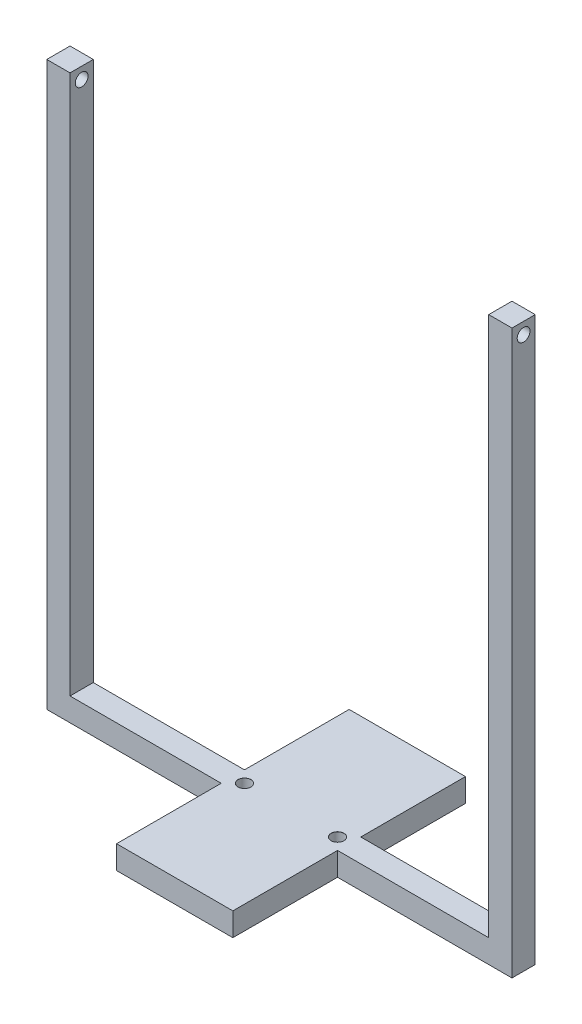
ISO-10303-21;
HEADER;
FILE_DESCRIPTION(('STEP AP214'),'2;1');
FILE_NAME('part.step','',(''),(''),'','','');
FILE_SCHEMA(('AUTOMOTIVE_DESIGN { 1 0 10303 214 1 1 1 1 }'));
ENDSEC;
DATA;
#1=APPLICATION_CONTEXT('core data for automotive mechanical design processes');
#2=APPLICATION_PROTOCOL_DEFINITION('international standard','automotive_design',2000,#1);
#3=PRODUCT_CONTEXT('',#1,'mechanical');
#4=PRODUCT('Part','Part','',(#3));
#5=PRODUCT_RELATED_PRODUCT_CATEGORY('part','',(#4));
#6=PRODUCT_DEFINITION_FORMATION('','',#4);
#7=PRODUCT_DEFINITION_CONTEXT('part definition',#1,'design');
#8=PRODUCT_DEFINITION('design','',#6,#7);
#9=PRODUCT_DEFINITION_SHAPE('','',#8);
#10=(LENGTH_UNIT() NAMED_UNIT(*) SI_UNIT(.MILLI.,.METRE.));
#11=(NAMED_UNIT(*) PLANE_ANGLE_UNIT() SI_UNIT($,.RADIAN.));
#12=(NAMED_UNIT(*) SI_UNIT($,.STERADIAN.) SOLID_ANGLE_UNIT());
#13=UNCERTAINTY_MEASURE_WITH_UNIT(LENGTH_MEASURE(1.E-05),#10,'distance_accuracy_value','');
#14=(GEOMETRIC_REPRESENTATION_CONTEXT(3) GLOBAL_UNCERTAINTY_ASSIGNED_CONTEXT((#13)) GLOBAL_UNIT_ASSIGNED_CONTEXT((#10,
#11,#12)) REPRESENTATION_CONTEXT('',''));
#15=CARTESIAN_POINT('',(0.,0.,0.));
#16=DIRECTION('',(0.,0.,1.));
#17=DIRECTION('',(1.,0.,0.));
#18=AXIS2_PLACEMENT_3D('',#15,#16,#17);
#19=CARTESIAN_POINT('',(0.,25.,0.));
#20=DIRECTION('',(0.,1.,0.));
#21=DIRECTION('',(0.,0.,1.));
#22=AXIS2_PLACEMENT_3D('',#19,#20,#21);
#23=PLANE('',#22);
#24=CARTESIAN_POINT('',(-20.,25.,0.));
#25=DIRECTION('',(0.,1.,0.));
#26=DIRECTION('',(0.,0.,1.));
#27=AXIS2_PLACEMENT_3D('',#24,#25,#26);
#28=CIRCLE('',#27,2.775);
#29=CARTESIAN_POINT('',(-20.,25.,2.775));
#30=VERTEX_POINT('',#29);
#31=EDGE_CURVE('E617',#30,#30,#28,.T.);
#32=ORIENTED_EDGE('',*,*,#31,.F.);
#33=EDGE_LOOP('',(#32));
#34=FACE_BOUND('',#33,.T.);
#35=CARTESIAN_POINT('',(20.,25.,0.));
#36=DIRECTION('',(0.,1.,0.));
#37=DIRECTION('',(0.,0.,1.));
#38=AXIS2_PLACEMENT_3D('',#35,#36,#37);
#39=CIRCLE('',#38,2.775);
#40=CARTESIAN_POINT('',(20.,25.,2.77499999999999));
#41=VERTEX_POINT('',#40);
#42=EDGE_CURVE('E298',#41,#41,#39,.T.);
#43=ORIENTED_EDGE('',*,*,#42,.F.);
#44=EDGE_LOOP('',(#43));
#45=FACE_BOUND('',#44,.T.);
#46=DIRECTION('',(1.,0.,0.));
#47=VECTOR('',#46,1.);
#48=CARTESIAN_POINT('',(0.,25.,5.));
#49=LINE('',#48,#47);
#50=CARTESIAN_POINT('',(25.,25.,5.));
#51=VERTEX_POINT('',#50);
#52=CARTESIAN_POINT('',(90.,25.,5.));
#53=VERTEX_POINT('',#52);
#54=EDGE_CURVE('E63',#51,#53,#49,.T.);
#55=ORIENTED_EDGE('',*,*,#54,.T.);
#56=DIRECTION('',(0.,0.,1.));
#57=VECTOR('',#56,1.);
#58=CARTESIAN_POINT('',(90.,25.,-5.));
#59=LINE('',#58,#57);
#60=CARTESIAN_POINT('',(90.,25.,-5.));
#61=VERTEX_POINT('',#60);
#62=EDGE_CURVE('E58',#61,#53,#59,.T.);
#63=ORIENTED_EDGE('',*,*,#62,.F.);
#64=DIRECTION('',(1.,0.,0.));
#65=VECTOR('',#64,1.);
#66=CARTESIAN_POINT('',(0.,25.,-5.));
#67=LINE('',#66,#65);
#68=CARTESIAN_POINT('',(25.,25.,-5.));
#69=VERTEX_POINT('',#68);
#70=EDGE_CURVE('E217',#69,#61,#67,.T.);
#71=ORIENTED_EDGE('',*,*,#70,.F.);
#72=DIRECTION('',(0.,0.,1.));
#73=VECTOR('',#72,1.);
#74=CARTESIAN_POINT('',(24.9999999999999,25.,0.));
#75=LINE('',#74,#73);
#76=CARTESIAN_POINT('',(25.,25.,-50.));
#77=VERTEX_POINT('',#76);
#78=EDGE_CURVE('E219',#77,#69,#75,.T.);
#79=ORIENTED_EDGE('',*,*,#78,.F.);
#80=DIRECTION('',(1.,0.,0.));
#81=VECTOR('',#80,1.);
#82=CARTESIAN_POINT('',(0.,25.,-50.));
#83=LINE('',#82,#81);
#84=CARTESIAN_POINT('',(-25.,25.,-50.));
#85=VERTEX_POINT('',#84);
#86=EDGE_CURVE('E222',#85,#77,#83,.T.);
#87=ORIENTED_EDGE('',*,*,#86,.F.);
#88=DIRECTION('',(0.,0.,-1.));
#89=VECTOR('',#88,1.);
#90=CARTESIAN_POINT('',(-24.9999999999999,25.,0.));
#91=LINE('',#90,#89);
#92=CARTESIAN_POINT('',(-24.9999999999999,25.,-5.));
#93=VERTEX_POINT('',#92);
#94=EDGE_CURVE('E225',#93,#85,#91,.T.);
#95=ORIENTED_EDGE('',*,*,#94,.F.);
#96=DIRECTION('',(1.,0.,0.));
#97=VECTOR('',#96,1.);
#98=CARTESIAN_POINT('',(0.,25.,-5.));
#99=LINE('',#98,#97);
#100=CARTESIAN_POINT('',(-90.,25.,-5.));
#101=VERTEX_POINT('',#100);
#102=EDGE_CURVE('E228',#101,#93,#99,.T.);
#103=ORIENTED_EDGE('',*,*,#102,.F.);
#104=DIRECTION('',(0.,0.,-1.));
#105=VECTOR('',#104,1.);
#106=CARTESIAN_POINT('',(-90.,25.,-5.));
#107=LINE('',#106,#105);
#108=CARTESIAN_POINT('',(-90.,25.,5.));
#109=VERTEX_POINT('',#108);
#110=EDGE_CURVE('E183',#109,#101,#107,.T.);
#111=ORIENTED_EDGE('',*,*,#110,.F.);
#112=DIRECTION('',(1.,0.,0.));
#113=VECTOR('',#112,1.);
#114=CARTESIAN_POINT('',(0.,25.,5.));
#115=LINE('',#114,#113);
#116=CARTESIAN_POINT('',(-25.,25.,5.));
#117=VERTEX_POINT('',#116);
#118=EDGE_CURVE('E207',#109,#117,#115,.T.);
#119=ORIENTED_EDGE('',*,*,#118,.T.);
#120=DIRECTION('',(0.,0.,1.));
#121=VECTOR('',#120,1.);
#122=CARTESIAN_POINT('',(-24.9999999999999,25.,0.));
#123=LINE('',#122,#121);
#124=CARTESIAN_POINT('',(-25.,25.,50.));
#125=VERTEX_POINT('',#124);
#126=EDGE_CURVE('E209',#117,#125,#123,.T.);
#127=ORIENTED_EDGE('',*,*,#126,.T.);
#128=DIRECTION('',(1.,0.,0.));
#129=VECTOR('',#128,1.);
#130=CARTESIAN_POINT('',(0.,25.,50.));
#131=LINE('',#130,#129);
#132=CARTESIAN_POINT('',(25.,25.,50.));
#133=VERTEX_POINT('',#132);
#134=EDGE_CURVE('E212',#125,#133,#131,.T.);
#135=ORIENTED_EDGE('',*,*,#134,.T.);
#136=DIRECTION('',(0.,0.,-1.));
#137=VECTOR('',#136,1.);
#138=CARTESIAN_POINT('',(24.9999999999999,25.,0.));
#139=LINE('',#138,#137);
#140=EDGE_CURVE('E214',#133,#51,#139,.T.);
#141=ORIENTED_EDGE('',*,*,#140,.T.);
#142=EDGE_LOOP('',(#55,#63,#71,#79,#87,#95,#103,#111,#119,#127,#135,#141));
#143=FACE_BOUND('',#142,.T.);
#144=ADVANCED_FACE('F41',(#34,#45,#143),#23,.T.);
#145=CARTESIAN_POINT('',(0.,10.,0.));
#146=DIRECTION('',(0.,-1.,0.));
#147=DIRECTION('',(0.,0.,-1.));
#148=AXIS2_PLACEMENT_3D('',#145,#146,#147);
#149=CYLINDRICAL_SURFACE('',#148,10.);
#150=CARTESIAN_POINT('',(0.,10.,0.));
#151=DIRECTION('',(0.,1.,0.));
#152=DIRECTION('',(0.,0.,1.));
#153=AXIS2_PLACEMENT_3D('',#150,#151,#152);
#154=CIRCLE('',#153,10.);
#155=CARTESIAN_POINT('',(0.,10.,10.));
#156=VERTEX_POINT('',#155);
#157=EDGE_CURVE('E11',#156,#156,#154,.T.);
#158=ORIENTED_EDGE('',*,*,#157,.F.);
#159=EDGE_LOOP('',(#158));
#160=FACE_BOUND('',#159,.T.);
#161=CARTESIAN_POINT('',(0.,0.,0.));
#162=DIRECTION('',(0.,1.,0.));
#163=DIRECTION('',(0.,0.,1.));
#164=AXIS2_PLACEMENT_3D('',#161,#162,#163);
#165=CIRCLE('',#164,10.);
#166=CARTESIAN_POINT('',(0.,0.,10.));
#167=VERTEX_POINT('',#166);
#168=EDGE_CURVE('E50',#167,#167,#165,.T.);
#169=ORIENTED_EDGE('',*,*,#168,.T.);
#170=EDGE_LOOP('',(#169));
#171=FACE_BOUND('',#170,.T.);
#172=ADVANCED_FACE('F43',(#160,#171),#149,.T.);
#173=CARTESIAN_POINT('',(0.,0.,0.));
#174=DIRECTION('',(0.,1.,0.));
#175=DIRECTION('',(0.,0.,1.));
#176=AXIS2_PLACEMENT_3D('',#173,#174,#175);
#177=PLANE('',#176);
#178=ORIENTED_EDGE('',*,*,#168,.F.);
#179=EDGE_LOOP('',(#178));
#180=FACE_BOUND('',#179,.T.);
#181=ADVANCED_FACE('F397',(#180),#177,.F.);
#182=CARTESIAN_POINT('',(0.,15.,0.));
#183=DIRECTION('',(0.,-1.,0.));
#184=DIRECTION('',(0.,0.,-1.));
#185=AXIS2_PLACEMENT_3D('',#182,#183,#184);
#186=CYLINDRICAL_SURFACE('',#185,15.);
#187=CARTESIAN_POINT('',(0.,15.,0.));
#188=DIRECTION('',(0.,1.,0.));
#189=DIRECTION('',(0.,0.,1.));
#190=AXIS2_PLACEMENT_3D('',#187,#188,#189);
#191=CIRCLE('',#190,15.);
#192=CARTESIAN_POINT('',(0.,15.,15.));
#193=VERTEX_POINT('',#192);
#194=EDGE_CURVE('E282',#193,#193,#191,.T.);
#195=ORIENTED_EDGE('',*,*,#194,.F.);
#196=EDGE_LOOP('',(#195));
#197=FACE_BOUND('',#196,.T.);
#198=CARTESIAN_POINT('',(0.,10.,0.));
#199=DIRECTION('',(0.,1.,0.));
#200=DIRECTION('',(0.,0.,1.));
#201=AXIS2_PLACEMENT_3D('',#198,#199,#200);
#202=CIRCLE('',#201,15.);
#203=CARTESIAN_POINT('',(0.,10.,15.));
#204=VERTEX_POINT('',#203);
#205=EDGE_CURVE('E281',#204,#204,#202,.T.);
#206=ORIENTED_EDGE('',*,*,#205,.T.);
#207=EDGE_LOOP('',(#206));
#208=FACE_BOUND('',#207,.T.);
#209=ADVANCED_FACE('F432',(#197,#208),#186,.T.);
#210=CARTESIAN_POINT('',(0.,10.,0.));
#211=DIRECTION('',(0.,1.,0.));
#212=DIRECTION('',(0.,0.,1.));
#213=AXIS2_PLACEMENT_3D('',#210,#211,#212);
#214=PLANE('',#213);
#215=ORIENTED_EDGE('',*,*,#157,.T.);
#216=EDGE_LOOP('',(#215));
#217=FACE_BOUND('',#216,.T.);
#218=ORIENTED_EDGE('',*,*,#205,.F.);
#219=EDGE_LOOP('',(#218));
#220=FACE_BOUND('',#219,.T.);
#221=ADVANCED_FACE('F429',(#217,#220),#214,.F.);
#222=CARTESIAN_POINT('',(0.,25.,5.));
#223=DIRECTION('',(0.,0.,-1.));
#224=DIRECTION('',(-1.,0.,0.));
#225=AXIS2_PLACEMENT_3D('',#222,#223,#224);
#226=PLANE('',#225);
#227=DIRECTION('',(1.,0.,0.));
#228=VECTOR('',#227,1.);
#229=CARTESIAN_POINT('',(0.,15.,5.));
#230=LINE('',#229,#228);
#231=CARTESIAN_POINT('',(-100.,15.,5.));
#232=VERTEX_POINT('',#231);
#233=CARTESIAN_POINT('',(-25.,15.,5.));
#234=VERTEX_POINT('',#233);
#235=EDGE_CURVE('E206',#232,#234,#230,.T.);
#236=ORIENTED_EDGE('',*,*,#235,.T.);
#237=DIRECTION('',(0.,-1.,0.));
#238=VECTOR('',#237,1.);
#239=CARTESIAN_POINT('',(-25.,25.,5.));
#240=LINE('',#239,#238);
#241=EDGE_CURVE('E278',#117,#234,#240,.T.);
#242=ORIENTED_EDGE('',*,*,#241,.F.);
#243=ORIENTED_EDGE('',*,*,#118,.F.);
#244=DIRECTION('',(0.,-1.,0.));
#245=VECTOR('',#244,1.);
#246=CARTESIAN_POINT('',(-90.,257.,5.));
#247=LINE('',#246,#245);
#248=CARTESIAN_POINT('',(-90.,257.,5.));
#249=VERTEX_POINT('',#248);
#250=EDGE_CURVE('E203',#249,#109,#247,.T.);
#251=ORIENTED_EDGE('',*,*,#250,.F.);
#252=DIRECTION('',(1.,0.,0.));
#253=VECTOR('',#252,1.);
#254=CARTESIAN_POINT('',(-100.,257.,5.));
#255=LINE('',#254,#253);
#256=CARTESIAN_POINT('',(-100.,257.,5.));
#257=VERTEX_POINT('',#256);
#258=EDGE_CURVE('E191',#257,#249,#255,.T.);
#259=ORIENTED_EDGE('',*,*,#258,.F.);
#260=DIRECTION('',(0.,-1.,0.));
#261=VECTOR('',#260,1.);
#262=CARTESIAN_POINT('',(-100.,25.,5.));
#263=LINE('',#262,#261);
#264=EDGE_CURVE('E230',#257,#232,#263,.T.);
#265=ORIENTED_EDGE('',*,*,#264,.T.);
#266=EDGE_LOOP('',(#236,#242,#243,#251,#259,#265));
#267=FACE_BOUND('',#266,.T.);
#268=ADVANCED_FACE('F351',(#267),#226,.F.);
#269=CARTESIAN_POINT('',(-24.9999999999999,25.,0.));
#270=DIRECTION('',(1.,0.,0.));
#271=DIRECTION('',(0.,0.,-1.));
#272=AXIS2_PLACEMENT_3D('',#269,#270,#271);
#273=PLANE('',#272);
#274=DIRECTION('',(0.,0.,1.));
#275=VECTOR('',#274,1.);
#276=CARTESIAN_POINT('',(-24.9999999999999,15.,0.));
#277=LINE('',#276,#275);
#278=CARTESIAN_POINT('',(-25.,15.,50.));
#279=VERTEX_POINT('',#278);
#280=EDGE_CURVE('E233',#234,#279,#277,.T.);
#281=ORIENTED_EDGE('',*,*,#280,.T.);
#282=DIRECTION('',(0.,-1.,0.));
#283=VECTOR('',#282,1.);
#284=CARTESIAN_POINT('',(-25.,25.,50.));
#285=LINE('',#284,#283);
#286=EDGE_CURVE('E275',#125,#279,#285,.T.);
#287=ORIENTED_EDGE('',*,*,#286,.F.);
#288=ORIENTED_EDGE('',*,*,#126,.F.);
#289=ORIENTED_EDGE('',*,*,#241,.T.);
#290=EDGE_LOOP('',(#281,#287,#288,#289));
#291=FACE_BOUND('',#290,.T.);
#292=ADVANCED_FACE('F356',(#291),#273,.F.);
#293=CARTESIAN_POINT('',(0.,25.,50.));
#294=DIRECTION('',(0.,0.,-1.));
#295=DIRECTION('',(-1.,0.,0.));
#296=AXIS2_PLACEMENT_3D('',#293,#294,#295);
#297=PLANE('',#296);
#298=DIRECTION('',(1.,0.,0.));
#299=VECTOR('',#298,1.);
#300=CARTESIAN_POINT('',(0.,15.,50.));
#301=LINE('',#300,#299);
#302=CARTESIAN_POINT('',(25.,15.,50.));
#303=VERTEX_POINT('',#302);
#304=EDGE_CURVE('E235',#279,#303,#301,.T.);
#305=ORIENTED_EDGE('',*,*,#304,.T.);
#306=DIRECTION('',(0.,-1.,0.));
#307=VECTOR('',#306,1.);
#308=CARTESIAN_POINT('',(25.,25.,50.));
#309=LINE('',#308,#307);
#310=EDGE_CURVE('E272',#133,#303,#309,.T.);
#311=ORIENTED_EDGE('',*,*,#310,.F.);
#312=ORIENTED_EDGE('',*,*,#134,.F.);
#313=ORIENTED_EDGE('',*,*,#286,.T.);
#314=EDGE_LOOP('',(#305,#311,#312,#313));
#315=FACE_BOUND('',#314,.T.);
#316=ADVANCED_FACE('F361',(#315),#297,.F.);
#317=CARTESIAN_POINT('',(24.9999999999999,25.,0.));
#318=DIRECTION('',(-1.,0.,0.));
#319=DIRECTION('',(0.,0.,1.));
#320=AXIS2_PLACEMENT_3D('',#317,#318,#319);
#321=PLANE('',#320);
#322=DIRECTION('',(0.,0.,-1.));
#323=VECTOR('',#322,1.);
#324=CARTESIAN_POINT('',(24.9999999999999,15.,0.));
#325=LINE('',#324,#323);
#326=CARTESIAN_POINT('',(25.,15.,5.));
#327=VERTEX_POINT('',#326);
#328=EDGE_CURVE('E237',#303,#327,#325,.T.);
#329=ORIENTED_EDGE('',*,*,#328,.T.);
#330=DIRECTION('',(0.,-1.,0.));
#331=VECTOR('',#330,1.);
#332=CARTESIAN_POINT('',(25.,25.,5.));
#333=LINE('',#332,#331);
#334=EDGE_CURVE('E167',#51,#327,#333,.T.);
#335=ORIENTED_EDGE('',*,*,#334,.F.);
#336=ORIENTED_EDGE('',*,*,#140,.F.);
#337=ORIENTED_EDGE('',*,*,#310,.T.);
#338=EDGE_LOOP('',(#329,#335,#336,#337));
#339=FACE_BOUND('',#338,.T.);
#340=ADVANCED_FACE('F365',(#339),#321,.F.);
#341=CARTESIAN_POINT('',(0.,25.,5.));
#342=DIRECTION('',(0.,0.,-1.));
#343=DIRECTION('',(-1.,0.,0.));
#344=AXIS2_PLACEMENT_3D('',#341,#342,#343);
#345=PLANE('',#344);
#346=DIRECTION('',(1.,0.,0.));
#347=VECTOR('',#346,1.);
#348=CARTESIAN_POINT('',(0.,15.,5.));
#349=LINE('',#348,#347);
#350=CARTESIAN_POINT('',(100.,15.,5.));
#351=VERTEX_POINT('',#350);
#352=EDGE_CURVE('E162',#327,#351,#349,.T.);
#353=ORIENTED_EDGE('',*,*,#352,.T.);
#354=DIRECTION('',(0.,-1.,0.));
#355=VECTOR('',#354,1.);
#356=CARTESIAN_POINT('',(100.,25.,5.));
#357=LINE('',#356,#355);
#358=CARTESIAN_POINT('',(100.,257.,4.99999999999999));
#359=VERTEX_POINT('',#358);
#360=EDGE_CURVE('E155',#359,#351,#357,.T.);
#361=ORIENTED_EDGE('',*,*,#360,.F.);
#362=DIRECTION('',(1.,0.,0.));
#363=VECTOR('',#362,1.);
#364=CARTESIAN_POINT('',(100.,257.,4.99999999999999));
#365=LINE('',#364,#363);
#366=CARTESIAN_POINT('',(90.,257.,5.));
#367=VERTEX_POINT('',#366);
#368=EDGE_CURVE('E159',#367,#359,#365,.T.);
#369=ORIENTED_EDGE('',*,*,#368,.F.);
#370=DIRECTION('',(0.,-1.,0.));
#371=VECTOR('',#370,1.);
#372=CARTESIAN_POINT('',(90.,257.,5.));
#373=LINE('',#372,#371);
#374=EDGE_CURVE('E177',#367,#53,#373,.T.);
#375=ORIENTED_EDGE('',*,*,#374,.T.);
#376=ORIENTED_EDGE('',*,*,#54,.F.);
#377=ORIENTED_EDGE('',*,*,#334,.T.);
#378=EDGE_LOOP('',(#353,#361,#369,#375,#376,#377));
#379=FACE_BOUND('',#378,.T.);
#380=ADVANCED_FACE('F157',(#379),#345,.F.);
#381=CARTESIAN_POINT('',(100.,25.,-2.77555756156289E-13));
#382=DIRECTION('',(1.,0.,0.));
#383=DIRECTION('',(0.,0.,-1.));
#384=AXIS2_PLACEMENT_3D('',#381,#382,#383);
#385=PLANE('',#384);
#386=CARTESIAN_POINT('',(100.,252.,0.));
#387=DIRECTION('',(-1.,0.,0.));
#388=DIRECTION('',(0.,0.,1.));
#389=AXIS2_PLACEMENT_3D('',#386,#387,#388);
#390=CIRCLE('',#389,2.74999999999997);
#391=CARTESIAN_POINT('',(100.,252.,2.74999999999997));
#392=VERTEX_POINT('',#391);
#393=EDGE_CURVE('E308',#392,#392,#390,.T.);
#394=ORIENTED_EDGE('',*,*,#393,.T.);
#395=EDGE_LOOP('',(#394));
#396=FACE_BOUND('',#395,.T.);
#397=DIRECTION('',(0.,0.,1.));
#398=VECTOR('',#397,1.);
#399=CARTESIAN_POINT('',(100.,15.,-2.77555756156289E-13));
#400=LINE('',#399,#398);
#401=CARTESIAN_POINT('',(100.,15.,-5.));
#402=VERTEX_POINT('',#401);
#403=EDGE_CURVE('E240',#402,#351,#400,.T.);
#404=ORIENTED_EDGE('',*,*,#403,.F.);
#405=DIRECTION('',(0.,-1.,0.));
#406=VECTOR('',#405,1.);
#407=CARTESIAN_POINT('',(100.,25.,-5.));
#408=LINE('',#407,#406);
#409=CARTESIAN_POINT('',(100.,257.,-5.));
#410=VERTEX_POINT('',#409);
#411=EDGE_CURVE('E168',#410,#402,#408,.T.);
#412=ORIENTED_EDGE('',*,*,#411,.F.);
#413=DIRECTION('',(0.,0.,-1.));
#414=VECTOR('',#413,1.);
#415=CARTESIAN_POINT('',(100.,257.,-5.));
#416=LINE('',#415,#414);
#417=EDGE_CURVE('E173',#359,#410,#416,.T.);
#418=ORIENTED_EDGE('',*,*,#417,.F.);
#419=ORIENTED_EDGE('',*,*,#360,.T.);
#420=EDGE_LOOP('',(#404,#412,#418,#419));
#421=FACE_BOUND('',#420,.T.);
#422=ADVANCED_FACE('F179',(#396,#421),#385,.T.);
#423=CARTESIAN_POINT('',(0.,25.,-5.));
#424=DIRECTION('',(0.,0.,-1.));
#425=DIRECTION('',(-1.,0.,0.));
#426=AXIS2_PLACEMENT_3D('',#423,#424,#425);
#427=PLANE('',#426);
#428=DIRECTION('',(1.,0.,0.));
#429=VECTOR('',#428,1.);
#430=CARTESIAN_POINT('',(0.,15.,-5.));
#431=LINE('',#430,#429);
#432=CARTESIAN_POINT('',(25.,15.,-5.));
#433=VERTEX_POINT('',#432);
#434=EDGE_CURVE('E242',#433,#402,#431,.T.);
#435=ORIENTED_EDGE('',*,*,#434,.F.);
#436=DIRECTION('',(0.,-1.,0.));
#437=VECTOR('',#436,1.);
#438=CARTESIAN_POINT('',(25.,25.,-5.));
#439=LINE('',#438,#437);
#440=EDGE_CURVE('E268',#69,#433,#439,.T.);
#441=ORIENTED_EDGE('',*,*,#440,.F.);
#442=ORIENTED_EDGE('',*,*,#70,.T.);
#443=DIRECTION('',(0.,-1.,0.));
#444=VECTOR('',#443,1.);
#445=CARTESIAN_POINT('',(90.,257.,-5.));
#446=LINE('',#445,#444);
#447=CARTESIAN_POINT('',(90.,257.,-5.));
#448=VERTEX_POINT('',#447);
#449=EDGE_CURVE('E317',#448,#61,#446,.T.);
#450=ORIENTED_EDGE('',*,*,#449,.F.);
#451=DIRECTION('',(-1.,0.,0.));
#452=VECTOR('',#451,1.);
#453=CARTESIAN_POINT('',(100.,257.,-5.));
#454=LINE('',#453,#452);
#455=EDGE_CURVE('E181',#410,#448,#454,.T.);
#456=ORIENTED_EDGE('',*,*,#455,.F.);
#457=ORIENTED_EDGE('',*,*,#411,.T.);
#458=EDGE_LOOP('',(#435,#441,#442,#450,#456,#457));
#459=FACE_BOUND('',#458,.T.);
#460=ADVANCED_FACE('F325',(#459),#427,.T.);
#461=CARTESIAN_POINT('',(24.9999999999999,25.,0.));
#462=DIRECTION('',(1.,0.,0.));
#463=DIRECTION('',(0.,0.,-1.));
#464=AXIS2_PLACEMENT_3D('',#461,#462,#463);
#465=PLANE('',#464);
#466=DIRECTION('',(0.,0.,1.));
#467=VECTOR('',#466,1.);
#468=CARTESIAN_POINT('',(24.9999999999999,15.,0.));
#469=LINE('',#468,#467);
#470=CARTESIAN_POINT('',(25.,15.,-50.));
#471=VERTEX_POINT('',#470);
#472=EDGE_CURVE('E245',#471,#433,#469,.T.);
#473=ORIENTED_EDGE('',*,*,#472,.F.);
#474=DIRECTION('',(0.,-1.,0.));
#475=VECTOR('',#474,1.);
#476=CARTESIAN_POINT('',(25.,25.,-50.));
#477=LINE('',#476,#475);
#478=EDGE_CURVE('E266',#77,#471,#477,.T.);
#479=ORIENTED_EDGE('',*,*,#478,.F.);
#480=ORIENTED_EDGE('',*,*,#78,.T.);
#481=ORIENTED_EDGE('',*,*,#440,.T.);
#482=EDGE_LOOP('',(#473,#479,#480,#481));
#483=FACE_BOUND('',#482,.T.);
#484=ADVANCED_FACE('F330',(#483),#465,.T.);
#485=CARTESIAN_POINT('',(0.,25.,-50.));
#486=DIRECTION('',(0.,0.,-1.));
#487=DIRECTION('',(-1.,0.,0.));
#488=AXIS2_PLACEMENT_3D('',#485,#486,#487);
#489=PLANE('',#488);
#490=DIRECTION('',(1.,0.,0.));
#491=VECTOR('',#490,1.);
#492=CARTESIAN_POINT('',(0.,15.,-50.));
#493=LINE('',#492,#491);
#494=CARTESIAN_POINT('',(-25.,15.,-50.));
#495=VERTEX_POINT('',#494);
#496=EDGE_CURVE('E248',#495,#471,#493,.T.);
#497=ORIENTED_EDGE('',*,*,#496,.F.);
#498=DIRECTION('',(0.,-1.,0.));
#499=VECTOR('',#498,1.);
#500=CARTESIAN_POINT('',(-25.,25.,-50.));
#501=LINE('',#500,#499);
#502=EDGE_CURVE('E264',#85,#495,#501,.T.);
#503=ORIENTED_EDGE('',*,*,#502,.F.);
#504=ORIENTED_EDGE('',*,*,#86,.T.);
#505=ORIENTED_EDGE('',*,*,#478,.T.);
#506=EDGE_LOOP('',(#497,#503,#504,#505));
#507=FACE_BOUND('',#506,.T.);
#508=ADVANCED_FACE('F333',(#507),#489,.T.);
#509=CARTESIAN_POINT('',(-24.9999999999999,25.,0.));
#510=DIRECTION('',(-1.,0.,0.));
#511=DIRECTION('',(0.,0.,1.));
#512=AXIS2_PLACEMENT_3D('',#509,#510,#511);
#513=PLANE('',#512);
#514=DIRECTION('',(0.,0.,-1.));
#515=VECTOR('',#514,1.);
#516=CARTESIAN_POINT('',(-24.9999999999999,15.,0.));
#517=LINE('',#516,#515);
#518=CARTESIAN_POINT('',(-24.9999999999999,15.,-5.));
#519=VERTEX_POINT('',#518);
#520=EDGE_CURVE('E251',#519,#495,#517,.T.);
#521=ORIENTED_EDGE('',*,*,#520,.F.);
#522=DIRECTION('',(0.,-1.,0.));
#523=VECTOR('',#522,1.);
#524=CARTESIAN_POINT('',(-24.9999999999999,25.,-5.));
#525=LINE('',#524,#523);
#526=EDGE_CURVE('E262',#93,#519,#525,.T.);
#527=ORIENTED_EDGE('',*,*,#526,.F.);
#528=ORIENTED_EDGE('',*,*,#94,.T.);
#529=ORIENTED_EDGE('',*,*,#502,.T.);
#530=EDGE_LOOP('',(#521,#527,#528,#529));
#531=FACE_BOUND('',#530,.T.);
#532=ADVANCED_FACE('F338',(#531),#513,.T.);
#533=CARTESIAN_POINT('',(0.,25.,-5.));
#534=DIRECTION('',(0.,0.,-1.));
#535=DIRECTION('',(-1.,0.,0.));
#536=AXIS2_PLACEMENT_3D('',#533,#534,#535);
#537=PLANE('',#536);
#538=DIRECTION('',(1.,0.,0.));
#539=VECTOR('',#538,1.);
#540=CARTESIAN_POINT('',(0.,15.,-5.));
#541=LINE('',#540,#539);
#542=CARTESIAN_POINT('',(-100.,15.,-5.));
#543=VERTEX_POINT('',#542);
#544=EDGE_CURVE('E254',#543,#519,#541,.T.);
#545=ORIENTED_EDGE('',*,*,#544,.F.);
#546=DIRECTION('',(0.,-1.,0.));
#547=VECTOR('',#546,1.);
#548=CARTESIAN_POINT('',(-100.,25.,-5.));
#549=LINE('',#548,#547);
#550=CARTESIAN_POINT('',(-100.,257.,-5.));
#551=VERTEX_POINT('',#550);
#552=EDGE_CURVE('E260',#551,#543,#549,.T.);
#553=ORIENTED_EDGE('',*,*,#552,.F.);
#554=DIRECTION('',(-1.,0.,0.));
#555=VECTOR('',#554,1.);
#556=CARTESIAN_POINT('',(-100.,257.,-5.));
#557=LINE('',#556,#555);
#558=CARTESIAN_POINT('',(-90.,257.,-5.));
#559=VERTEX_POINT('',#558);
#560=EDGE_CURVE('E195',#559,#551,#557,.T.);
#561=ORIENTED_EDGE('',*,*,#560,.F.);
#562=DIRECTION('',(0.,-1.,0.));
#563=VECTOR('',#562,1.);
#564=CARTESIAN_POINT('',(-90.,257.,-5.));
#565=LINE('',#564,#563);
#566=EDGE_CURVE('E198',#559,#101,#565,.T.);
#567=ORIENTED_EDGE('',*,*,#566,.T.);
#568=ORIENTED_EDGE('',*,*,#102,.T.);
#569=ORIENTED_EDGE('',*,*,#526,.T.);
#570=EDGE_LOOP('',(#545,#553,#561,#567,#568,#569));
#571=FACE_BOUND('',#570,.T.);
#572=ADVANCED_FACE('F341',(#571),#537,.T.);
#573=CARTESIAN_POINT('',(-100.,25.,0.));
#574=DIRECTION('',(1.,0.,0.));
#575=DIRECTION('',(0.,0.,-1.));
#576=AXIS2_PLACEMENT_3D('',#573,#574,#575);
#577=PLANE('',#576);
#578=CARTESIAN_POINT('',(-100.,252.,0.));
#579=DIRECTION('',(-1.,0.,0.));
#580=DIRECTION('',(0.,0.,1.));
#581=AXIS2_PLACEMENT_3D('',#578,#579,#580);
#582=CIRCLE('',#581,2.77500000000003);
#583=CARTESIAN_POINT('',(-100.,252.,2.77500000000003));
#584=VERTEX_POINT('',#583);
#585=EDGE_CURVE('E290',#584,#584,#582,.T.);
#586=ORIENTED_EDGE('',*,*,#585,.F.);
#587=EDGE_LOOP('',(#586));
#588=FACE_BOUND('',#587,.T.);
#589=DIRECTION('',(0.,0.,1.));
#590=VECTOR('',#589,1.);
#591=CARTESIAN_POINT('',(-100.,15.,0.));
#592=LINE('',#591,#590);
#593=EDGE_CURVE('E210',#543,#232,#592,.T.);
#594=ORIENTED_EDGE('',*,*,#593,.T.);
#595=ORIENTED_EDGE('',*,*,#264,.F.);
#596=DIRECTION('',(0.,0.,1.));
#597=VECTOR('',#596,1.);
#598=CARTESIAN_POINT('',(-100.,257.,-5.));
#599=LINE('',#598,#597);
#600=EDGE_CURVE('E188',#551,#257,#599,.T.);
#601=ORIENTED_EDGE('',*,*,#600,.F.);
#602=ORIENTED_EDGE('',*,*,#552,.T.);
#603=EDGE_LOOP('',(#594,#595,#601,#602));
#604=FACE_BOUND('',#603,.T.);
#605=ADVANCED_FACE('F372',(#588,#604),#577,.F.);
#606=CARTESIAN_POINT('',(0.,15.,0.));
#607=DIRECTION('',(0.,1.,0.));
#608=DIRECTION('',(0.,0.,1.));
#609=AXIS2_PLACEMENT_3D('',#606,#607,#608);
#610=PLANE('',#609);
#611=CARTESIAN_POINT('',(-20.,15.,0.));
#612=DIRECTION('',(0.,1.,0.));
#613=DIRECTION('',(0.,0.,1.));
#614=AXIS2_PLACEMENT_3D('',#611,#612,#613);
#615=CIRCLE('',#614,2.74999999999997);
#616=CARTESIAN_POINT('',(-20.,15.,2.74999999999997));
#617=VERTEX_POINT('',#616);
#618=EDGE_CURVE('E45',#617,#617,#615,.T.);
#619=ORIENTED_EDGE('',*,*,#618,.T.);
#620=EDGE_LOOP('',(#619));
#621=FACE_BOUND('',#620,.T.);
#622=CARTESIAN_POINT('',(20.,15.,0.));
#623=DIRECTION('',(0.,1.,0.));
#624=DIRECTION('',(0.,0.,1.));
#625=AXIS2_PLACEMENT_3D('',#622,#623,#624);
#626=CIRCLE('',#625,2.74999999999997);
#627=CARTESIAN_POINT('',(20.,15.,2.74999999999997));
#628=VERTEX_POINT('',#627);
#629=EDGE_CURVE('E288',#628,#628,#626,.T.);
#630=ORIENTED_EDGE('',*,*,#629,.T.);
#631=EDGE_LOOP('',(#630));
#632=FACE_BOUND('',#631,.T.);
#633=ORIENTED_EDGE('',*,*,#194,.T.);
#634=EDGE_LOOP('',(#633));
#635=FACE_BOUND('',#634,.T.);
#636=ORIENTED_EDGE('',*,*,#235,.F.);
#637=ORIENTED_EDGE('',*,*,#593,.F.);
#638=ORIENTED_EDGE('',*,*,#544,.T.);
#639=ORIENTED_EDGE('',*,*,#520,.T.);
#640=ORIENTED_EDGE('',*,*,#496,.T.);
#641=ORIENTED_EDGE('',*,*,#472,.T.);
#642=ORIENTED_EDGE('',*,*,#434,.T.);
#643=ORIENTED_EDGE('',*,*,#403,.T.);
#644=ORIENTED_EDGE('',*,*,#352,.F.);
#645=ORIENTED_EDGE('',*,*,#328,.F.);
#646=ORIENTED_EDGE('',*,*,#304,.F.);
#647=ORIENTED_EDGE('',*,*,#280,.F.);
#648=EDGE_LOOP('',(#636,#637,#638,#639,#640,#641,#642,#643,#644,#645,#646,#647));
#649=FACE_BOUND('',#648,.T.);
#650=ADVANCED_FACE('F369',(#621,#632,#635,#649),#610,.F.);
#651=CARTESIAN_POINT('',(-90.,257.,-5.));
#652=DIRECTION('',(-1.,0.,0.));
#653=DIRECTION('',(0.,0.,1.));
#654=AXIS2_PLACEMENT_3D('',#651,#652,#653);
#655=PLANE('',#654);
#656=CARTESIAN_POINT('',(-90.,252.,0.));
#657=DIRECTION('',(-1.,0.,0.));
#658=DIRECTION('',(0.,0.,1.));
#659=AXIS2_PLACEMENT_3D('',#656,#657,#658);
#660=CIRCLE('',#659,2.74999999999997);
#661=CARTESIAN_POINT('',(-90.,252.,2.74999999999997));
#662=VERTEX_POINT('',#661);
#663=EDGE_CURVE('E314',#662,#662,#660,.T.);
#664=ORIENTED_EDGE('',*,*,#663,.T.);
#665=EDGE_LOOP('',(#664));
#666=FACE_BOUND('',#665,.T.);
#667=ORIENTED_EDGE('',*,*,#110,.T.);
#668=ORIENTED_EDGE('',*,*,#566,.F.);
#669=DIRECTION('',(0.,0.,-1.));
#670=VECTOR('',#669,1.);
#671=CARTESIAN_POINT('',(-90.,257.,-5.));
#672=LINE('',#671,#670);
#673=EDGE_CURVE('E193',#249,#559,#672,.T.);
#674=ORIENTED_EDGE('',*,*,#673,.F.);
#675=ORIENTED_EDGE('',*,*,#250,.T.);
#676=EDGE_LOOP('',(#667,#668,#674,#675));
#677=FACE_BOUND('',#676,.T.);
#678=ADVANCED_FACE('F346',(#666,#677),#655,.F.);
#679=CARTESIAN_POINT('',(0.,257.,0.));
#680=DIRECTION('',(0.,1.,0.));
#681=DIRECTION('',(0.,0.,1.));
#682=AXIS2_PLACEMENT_3D('',#679,#680,#681);
#683=PLANE('',#682);
#684=ORIENTED_EDGE('',*,*,#600,.T.);
#685=ORIENTED_EDGE('',*,*,#258,.T.);
#686=ORIENTED_EDGE('',*,*,#673,.T.);
#687=ORIENTED_EDGE('',*,*,#560,.T.);
#688=EDGE_LOOP('',(#684,#685,#686,#687));
#689=FACE_BOUND('',#688,.T.);
#690=ADVANCED_FACE('F375',(#689),#683,.T.);
#691=CARTESIAN_POINT('',(90.,257.,-5.));
#692=DIRECTION('',(1.,0.,0.));
#693=DIRECTION('',(0.,0.,-1.));
#694=AXIS2_PLACEMENT_3D('',#691,#692,#693);
#695=PLANE('',#694);
#696=CARTESIAN_POINT('',(90.,252.,0.));
#697=DIRECTION('',(1.,0.,0.));
#698=DIRECTION('',(0.,0.,-1.));
#699=AXIS2_PLACEMENT_3D('',#696,#697,#698);
#700=CIRCLE('',#699,2.74999999999997);
#701=CARTESIAN_POINT('',(90.,252.,-2.74999999999997));
#702=VERTEX_POINT('',#701);
#703=EDGE_CURVE('E311',#702,#702,#700,.T.);
#704=ORIENTED_EDGE('',*,*,#703,.T.);
#705=EDGE_LOOP('',(#704));
#706=FACE_BOUND('',#705,.T.);
#707=ORIENTED_EDGE('',*,*,#62,.T.);
#708=ORIENTED_EDGE('',*,*,#374,.F.);
#709=DIRECTION('',(0.,0.,1.));
#710=VECTOR('',#709,1.);
#711=CARTESIAN_POINT('',(90.,257.,-5.));
#712=LINE('',#711,#710);
#713=EDGE_CURVE('E175',#448,#367,#712,.T.);
#714=ORIENTED_EDGE('',*,*,#713,.F.);
#715=ORIENTED_EDGE('',*,*,#449,.T.);
#716=EDGE_LOOP('',(#707,#708,#714,#715));
#717=FACE_BOUND('',#716,.T.);
#718=ADVANCED_FACE('F321',(#706,#717),#695,.F.);
#719=CARTESIAN_POINT('',(0.,257.,0.));
#720=DIRECTION('',(0.,-1.,0.));
#721=DIRECTION('',(0.,0.,-1.));
#722=AXIS2_PLACEMENT_3D('',#719,#720,#721);
#723=PLANE('',#722);
#724=ORIENTED_EDGE('',*,*,#417,.T.);
#725=ORIENTED_EDGE('',*,*,#455,.T.);
#726=ORIENTED_EDGE('',*,*,#713,.T.);
#727=ORIENTED_EDGE('',*,*,#368,.T.);
#728=EDGE_LOOP('',(#724,#725,#726,#727));
#729=FACE_BOUND('',#728,.T.);
#730=ADVANCED_FACE('F172',(#729),#723,.F.);
#731=CARTESIAN_POINT('',(-100.,252.,0.));
#732=DIRECTION('',(-1.,0.,0.));
#733=DIRECTION('',(0.,0.,1.));
#734=AXIS2_PLACEMENT_3D('',#731,#732,#733);
#735=CYLINDRICAL_SURFACE('',#734,2.74999999999997);
#736=ORIENTED_EDGE('',*,*,#393,.F.);
#737=EDGE_LOOP('',(#736));
#738=FACE_BOUND('',#737,.T.);
#739=ORIENTED_EDGE('',*,*,#703,.F.);
#740=EDGE_LOOP('',(#739));
#741=FACE_BOUND('',#740,.T.);
#742=ADVANCED_FACE('F545',(#738,#741),#735,.F.);
#743=CARTESIAN_POINT('',(-99.975,252.,0.));
#744=DIRECTION('',(-1.,0.,0.));
#745=DIRECTION('',(0.,0.,1.));
#746=AXIS2_PLACEMENT_3D('',#743,#744,#745);
#747=CIRCLE('',#746,2.74999999999997);
#748=CARTESIAN_POINT('',(-99.975,252.,2.74999999999997));
#749=VERTEX_POINT('',#748);
#750=EDGE_CURVE('E295',#749,#749,#747,.T.);
#751=ORIENTED_EDGE('',*,*,#750,.T.);
#752=EDGE_LOOP('',(#751));
#753=FACE_BOUND('',#752,.T.);
#754=ORIENTED_EDGE('',*,*,#663,.F.);
#755=EDGE_LOOP('',(#754));
#756=FACE_BOUND('',#755,.T.);
#757=ADVANCED_FACE('F552',(#753,#756),#735,.F.);
#758=CARTESIAN_POINT('',(-100.,252.,0.));
#759=DIRECTION('',(-1.,0.,0.));
#760=DIRECTION('',(0.,0.,1.));
#761=AXIS2_PLACEMENT_3D('',#758,#759,#760);
#762=CONICAL_SURFACE('',#761,2.77500000000003,0.785398163397448);
#763=ORIENTED_EDGE('',*,*,#750,.F.);
#764=EDGE_LOOP('',(#763));
#765=FACE_BOUND('',#764,.T.);
#766=ORIENTED_EDGE('',*,*,#585,.T.);
#767=EDGE_LOOP('',(#766));
#768=FACE_BOUND('',#767,.T.);
#769=ADVANCED_FACE('F562',(#765,#768),#762,.F.);
#770=CARTESIAN_POINT('',(20.,25.,0.));
#771=DIRECTION('',(0.,1.,0.));
#772=DIRECTION('',(0.,0.,1.));
#773=AXIS2_PLACEMENT_3D('',#770,#771,#772);
#774=CYLINDRICAL_SURFACE('',#773,2.74999999999997);
#775=CARTESIAN_POINT('',(20.,24.975,0.));
#776=DIRECTION('',(0.,1.,0.));
#777=DIRECTION('',(0.,0.,1.));
#778=AXIS2_PLACEMENT_3D('',#775,#776,#777);
#779=CIRCLE('',#778,2.74999999999997);
#780=CARTESIAN_POINT('',(20.,24.975,2.74999999999997));
#781=VERTEX_POINT('',#780);
#782=EDGE_CURVE('E291',#781,#781,#779,.T.);
#783=ORIENTED_EDGE('',*,*,#782,.T.);
#784=EDGE_LOOP('',(#783));
#785=FACE_BOUND('',#784,.T.);
#786=ORIENTED_EDGE('',*,*,#629,.F.);
#787=EDGE_LOOP('',(#786));
#788=FACE_BOUND('',#787,.T.);
#789=ADVANCED_FACE('F570',(#785,#788),#774,.F.);
#790=CARTESIAN_POINT('',(20.,25.,0.));
#791=DIRECTION('',(0.,1.,0.));
#792=DIRECTION('',(0.,0.,1.));
#793=AXIS2_PLACEMENT_3D('',#790,#791,#792);
#794=CONICAL_SURFACE('',#793,2.775,0.785398163397448);
#795=ORIENTED_EDGE('',*,*,#782,.F.);
#796=EDGE_LOOP('',(#795));
#797=FACE_BOUND('',#796,.T.);
#798=ORIENTED_EDGE('',*,*,#42,.T.);
#799=EDGE_LOOP('',(#798));
#800=FACE_BOUND('',#799,.T.);
#801=ADVANCED_FACE('F580',(#797,#800),#794,.F.);
#802=CARTESIAN_POINT('',(-20.,25.,0.));
#803=DIRECTION('',(0.,1.,0.));
#804=DIRECTION('',(0.,0.,1.));
#805=AXIS2_PLACEMENT_3D('',#802,#803,#804);
#806=CYLINDRICAL_SURFACE('',#805,2.74999999999997);
#807=CARTESIAN_POINT('',(-20.,24.975,0.));
#808=DIRECTION('',(0.,1.,0.));
#809=DIRECTION('',(0.,0.,1.));
#810=AXIS2_PLACEMENT_3D('',#807,#808,#809);
#811=CIRCLE('',#810,2.74999999999997);
#812=CARTESIAN_POINT('',(-20.,24.975,2.74999999999997));
#813=VERTEX_POINT('',#812);
#814=EDGE_CURVE('E615',#813,#813,#811,.T.);
#815=ORIENTED_EDGE('',*,*,#814,.T.);
#816=EDGE_LOOP('',(#815));
#817=FACE_BOUND('',#816,.T.);
#818=ORIENTED_EDGE('',*,*,#618,.F.);
#819=EDGE_LOOP('',(#818));
#820=FACE_BOUND('',#819,.T.);
#821=ADVANCED_FACE('F589',(#817,#820),#806,.F.);
#822=CARTESIAN_POINT('',(-20.,25.,0.));
#823=DIRECTION('',(0.,1.,0.));
#824=DIRECTION('',(0.,0.,1.));
#825=AXIS2_PLACEMENT_3D('',#822,#823,#824);
#826=CONICAL_SURFACE('',#825,2.775,0.785398163397448);
#827=ORIENTED_EDGE('',*,*,#814,.F.);
#828=EDGE_LOOP('',(#827));
#829=FACE_BOUND('',#828,.T.);
#830=ORIENTED_EDGE('',*,*,#31,.T.);
#831=EDGE_LOOP('',(#830));
#832=FACE_BOUND('',#831,.T.);
#833=ADVANCED_FACE('F599',(#829,#832),#826,.F.);
#834=CLOSED_SHELL('',(#144,#172,#181,#209,#221,#268,#292,#316,#340,#380,#422,#460,#484,#508,
#532,#572,#605,#650,#678,#690,#718,#730,#742,#757,#769,#789,#801,#821,#833));
#835=MANIFOLD_SOLID_BREP('B2',#834);
#836=ADVANCED_BREP_SHAPE_REPRESENTATION('',(#18,#835),#14);
#837=SHAPE_DEFINITION_REPRESENTATION(#9,#836);
ENDSEC;
END-ISO-10303-21;
